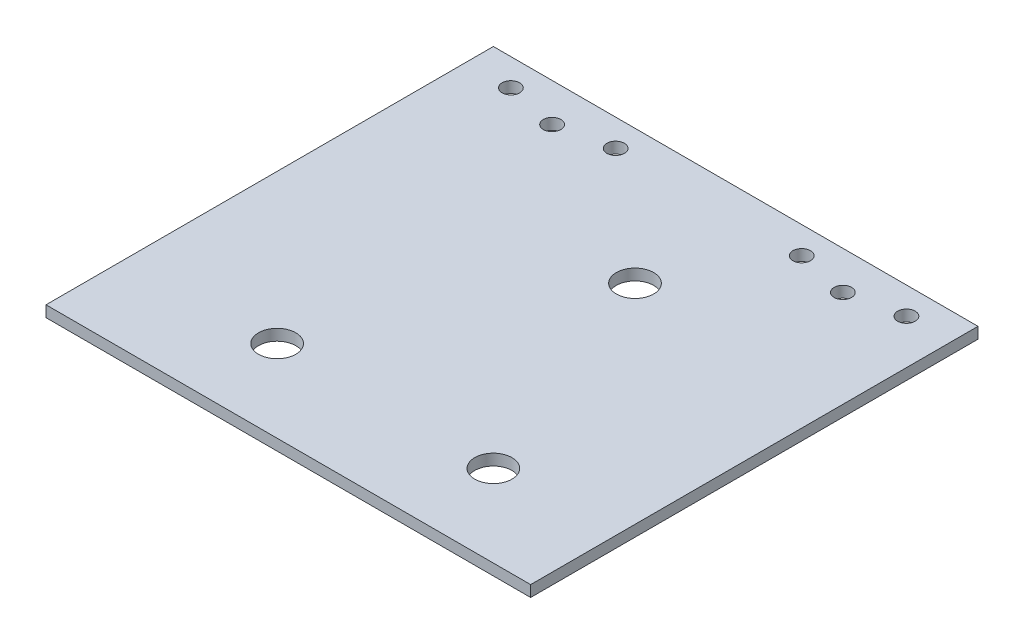
ISO-10303-21;
HEADER;
FILE_DESCRIPTION(('STEP AP214'),'2;1');
FILE_NAME('part.step','',(''),(''),'','','');
FILE_SCHEMA(('AUTOMOTIVE_DESIGN { 1 0 10303 214 1 1 1 1 }'));
ENDSEC;
DATA;
#1=APPLICATION_CONTEXT('core data for automotive mechanical design processes');
#2=APPLICATION_PROTOCOL_DEFINITION('international standard','automotive_design',2000,#1);
#3=PRODUCT_CONTEXT('',#1,'mechanical');
#4=PRODUCT('Part','Part','',(#3));
#5=PRODUCT_RELATED_PRODUCT_CATEGORY('part','',(#4));
#6=PRODUCT_DEFINITION_FORMATION('','',#4);
#7=PRODUCT_DEFINITION_CONTEXT('part definition',#1,'design');
#8=PRODUCT_DEFINITION('design','',#6,#7);
#9=PRODUCT_DEFINITION_SHAPE('','',#8);
#10=(LENGTH_UNIT() NAMED_UNIT(*) SI_UNIT(.MILLI.,.METRE.));
#11=(NAMED_UNIT(*) PLANE_ANGLE_UNIT() SI_UNIT($,.RADIAN.));
#12=(NAMED_UNIT(*) SI_UNIT($,.STERADIAN.) SOLID_ANGLE_UNIT());
#13=UNCERTAINTY_MEASURE_WITH_UNIT(LENGTH_MEASURE(1.E-05),#10,'distance_accuracy_value','');
#14=(GEOMETRIC_REPRESENTATION_CONTEXT(3) GLOBAL_UNCERTAINTY_ASSIGNED_CONTEXT((#13)) GLOBAL_UNIT_ASSIGNED_CONTEXT((#10,
#11,#12)) REPRESENTATION_CONTEXT('',''));
#15=CARTESIAN_POINT('',(0.,0.,0.));
#16=DIRECTION('',(0.,0.,1.));
#17=DIRECTION('',(1.,0.,0.));
#18=AXIS2_PLACEMENT_3D('',#15,#16,#17);
#19=CARTESIAN_POINT('',(0.,3.,0.));
#20=DIRECTION('',(1.,0.,0.));
#21=DIRECTION('',(0.,0.,-1.));
#22=AXIS2_PLACEMENT_3D('',#19,#20,#21);
#23=PLANE('',#22);
#24=DIRECTION('',(0.,-1.,0.));
#25=VECTOR('',#24,1.);
#26=CARTESIAN_POINT('',(0.,3.,30.));
#27=LINE('',#26,#25);
#28=CARTESIAN_POINT('',(0.,3.,30.));
#29=VERTEX_POINT('',#28);
#30=CARTESIAN_POINT('',(0.,0.,30.));
#31=VERTEX_POINT('',#30);
#32=EDGE_CURVE('E110',#29,#31,#27,.T.);
#33=ORIENTED_EDGE('',*,*,#32,.T.);
#34=DIRECTION('',(0.,0.,1.));
#35=VECTOR('',#34,1.);
#36=CARTESIAN_POINT('',(0.,0.,0.));
#37=LINE('',#36,#35);
#38=CARTESIAN_POINT('',(0.,0.,150.));
#39=VERTEX_POINT('',#38);
#40=EDGE_CURVE('E77',#31,#39,#37,.T.);
#41=ORIENTED_EDGE('',*,*,#40,.T.);
#42=DIRECTION('',(0.,-1.,0.));
#43=VECTOR('',#42,1.);
#44=CARTESIAN_POINT('',(0.,3.,150.));
#45=LINE('',#44,#43);
#46=CARTESIAN_POINT('',(0.,3.,150.));
#47=VERTEX_POINT('',#46);
#48=EDGE_CURVE('E11',#47,#39,#45,.T.);
#49=ORIENTED_EDGE('',*,*,#48,.F.);
#50=DIRECTION('',(0.,0.,1.));
#51=VECTOR('',#50,1.);
#52=CARTESIAN_POINT('',(0.,3.,0.));
#53=LINE('',#52,#51);
#54=EDGE_CURVE('E85',#29,#47,#53,.T.);
#55=ORIENTED_EDGE('',*,*,#54,.F.);
#56=EDGE_LOOP('',(#33,#41,#49,#55));
#57=FACE_BOUND('',#56,.T.);
#58=ADVANCED_FACE('F33',(#57),#23,.F.);
#59=CARTESIAN_POINT('',(130.,3.,0.));
#60=DIRECTION('',(-1.,0.,0.));
#61=DIRECTION('',(0.,0.,1.));
#62=AXIS2_PLACEMENT_3D('',#59,#60,#61);
#63=PLANE('',#62);
#64=DIRECTION('',(0.,-1.,0.));
#65=VECTOR('',#64,1.);
#66=CARTESIAN_POINT('',(130.,3.,30.));
#67=LINE('',#66,#65);
#68=CARTESIAN_POINT('',(130.,3.,30.));
#69=VERTEX_POINT('',#68);
#70=CARTESIAN_POINT('',(130.,0.,30.));
#71=VERTEX_POINT('',#70);
#72=EDGE_CURVE('E47',#69,#71,#67,.T.);
#73=ORIENTED_EDGE('',*,*,#72,.F.);
#74=DIRECTION('',(0.,0.,-1.));
#75=VECTOR('',#74,1.);
#76=CARTESIAN_POINT('',(130.,3.,0.));
#77=LINE('',#76,#75);
#78=CARTESIAN_POINT('',(130.,3.,150.));
#79=VERTEX_POINT('',#78);
#80=EDGE_CURVE('E82',#79,#69,#77,.T.);
#81=ORIENTED_EDGE('',*,*,#80,.F.);
#82=DIRECTION('',(0.,-1.,0.));
#83=VECTOR('',#82,1.);
#84=CARTESIAN_POINT('',(130.,3.,150.));
#85=LINE('',#84,#83);
#86=CARTESIAN_POINT('',(130.,0.,150.));
#87=VERTEX_POINT('',#86);
#88=EDGE_CURVE('E40',#79,#87,#85,.T.);
#89=ORIENTED_EDGE('',*,*,#88,.T.);
#90=DIRECTION('',(0.,0.,-1.));
#91=VECTOR('',#90,1.);
#92=CARTESIAN_POINT('',(130.,0.,0.));
#93=LINE('',#92,#91);
#94=EDGE_CURVE('E76',#87,#71,#93,.T.);
#95=ORIENTED_EDGE('',*,*,#94,.T.);
#96=EDGE_LOOP('',(#73,#81,#89,#95));
#97=FACE_BOUND('',#96,.T.);
#98=ADVANCED_FACE('F81',(#97),#63,.F.);
#99=CARTESIAN_POINT('',(0.,3.,0.));
#100=DIRECTION('',(0.,1.,0.));
#101=DIRECTION('',(0.,0.,1.));
#102=AXIS2_PLACEMENT_3D('',#99,#100,#101);
#103=PLANE('',#102);
#104=CARTESIAN_POINT('',(26.,3.,40.25));
#105=DIRECTION('',(0.,1.,0.));
#106=DIRECTION('',(0.,0.,1.));
#107=AXIS2_PLACEMENT_3D('',#104,#105,#106);
#108=CIRCLE('',#107,2.35);
#109=CARTESIAN_POINT('',(26.,3.,37.9));
#110=VERTEX_POINT('',#109);
#111=EDGE_CURVE('E145',#110,#110,#108,.T.);
#112=ORIENTED_EDGE('',*,*,#111,.F.);
#113=EDGE_LOOP('',(#112));
#114=FACE_BOUND('',#113,.T.);
#115=CARTESIAN_POINT('',(40.05,3.,37.25));
#116=DIRECTION('',(0.,1.,0.));
#117=DIRECTION('',(0.,0.,1.));
#118=AXIS2_PLACEMENT_3D('',#115,#116,#117);
#119=CIRCLE('',#118,2.35);
#120=CARTESIAN_POINT('',(40.05,3.,34.9));
#121=VERTEX_POINT('',#120);
#122=EDGE_CURVE('E139',#121,#121,#119,.T.);
#123=ORIENTED_EDGE('',*,*,#122,.F.);
#124=EDGE_LOOP('',(#123));
#125=FACE_BOUND('',#124,.T.);
#126=CARTESIAN_POINT('',(11.95,3.,37.25));
#127=DIRECTION('',(0.,1.,0.));
#128=DIRECTION('',(0.,0.,1.));
#129=AXIS2_PLACEMENT_3D('',#126,#127,#128);
#130=CIRCLE('',#129,2.35);
#131=CARTESIAN_POINT('',(11.95,3.,34.9));
#132=VERTEX_POINT('',#131);
#133=EDGE_CURVE('E133',#132,#132,#130,.T.);
#134=ORIENTED_EDGE('',*,*,#133,.F.);
#135=EDGE_LOOP('',(#134));
#136=FACE_BOUND('',#135,.T.);
#137=CARTESIAN_POINT('',(104.,3.,40.25));
#138=DIRECTION('',(0.,1.,0.));
#139=DIRECTION('',(0.,0.,1.));
#140=AXIS2_PLACEMENT_3D('',#137,#138,#139);
#141=CIRCLE('',#140,2.35);
#142=CARTESIAN_POINT('',(104.,3.,37.9));
#143=VERTEX_POINT('',#142);
#144=EDGE_CURVE('E127',#143,#143,#141,.T.);
#145=ORIENTED_EDGE('',*,*,#144,.F.);
#146=EDGE_LOOP('',(#145));
#147=FACE_BOUND('',#146,.T.);
#148=CARTESIAN_POINT('',(118.05,3.,37.25));
#149=DIRECTION('',(0.,1.,0.));
#150=DIRECTION('',(0.,0.,1.));
#151=AXIS2_PLACEMENT_3D('',#148,#149,#150);
#152=CIRCLE('',#151,2.35);
#153=CARTESIAN_POINT('',(118.05,3.,34.9));
#154=VERTEX_POINT('',#153);
#155=EDGE_CURVE('E121',#154,#154,#152,.T.);
#156=ORIENTED_EDGE('',*,*,#155,.F.);
#157=EDGE_LOOP('',(#156));
#158=FACE_BOUND('',#157,.T.);
#159=CARTESIAN_POINT('',(89.95,3.,37.25));
#160=DIRECTION('',(0.,1.,0.));
#161=DIRECTION('',(0.,0.,1.));
#162=AXIS2_PLACEMENT_3D('',#159,#160,#161);
#163=CIRCLE('',#162,2.35);
#164=CARTESIAN_POINT('',(89.95,3.,34.9));
#165=VERTEX_POINT('',#164);
#166=EDGE_CURVE('E116',#165,#165,#163,.T.);
#167=ORIENTED_EDGE('',*,*,#166,.F.);
#168=EDGE_LOOP('',(#167));
#169=FACE_BOUND('',#168,.T.);
#170=CARTESIAN_POINT('',(74.,3.,66.));
#171=DIRECTION('',(0.,1.,0.));
#172=DIRECTION('',(0.,0.,1.));
#173=AXIS2_PLACEMENT_3D('',#170,#171,#172);
#174=CIRCLE('',#173,5.);
#175=CARTESIAN_POINT('',(74.,3.,71.));
#176=VERTEX_POINT('',#175);
#177=EDGE_CURVE('E95',#176,#176,#174,.T.);
#178=ORIENTED_EDGE('',*,*,#177,.F.);
#179=EDGE_LOOP('',(#178));
#180=FACE_BOUND('',#179,.T.);
#181=CARTESIAN_POINT('',(98.,3.,128.));
#182=DIRECTION('',(0.,1.,0.));
#183=DIRECTION('',(0.,0.,1.));
#184=AXIS2_PLACEMENT_3D('',#181,#182,#183);
#185=CIRCLE('',#184,5.);
#186=CARTESIAN_POINT('',(98.,3.,133.));
#187=VERTEX_POINT('',#186);
#188=EDGE_CURVE('E101',#187,#187,#185,.T.);
#189=ORIENTED_EDGE('',*,*,#188,.F.);
#190=EDGE_LOOP('',(#189));
#191=FACE_BOUND('',#190,.T.);
#192=CARTESIAN_POINT('',(40.,3.,128.));
#193=DIRECTION('',(0.,1.,0.));
#194=DIRECTION('',(0.,0.,1.));
#195=AXIS2_PLACEMENT_3D('',#192,#193,#194);
#196=CIRCLE('',#195,5.);
#197=CARTESIAN_POINT('',(40.,3.,133.));
#198=VERTEX_POINT('',#197);
#199=EDGE_CURVE('E107',#198,#198,#196,.T.);
#200=ORIENTED_EDGE('',*,*,#199,.F.);
#201=EDGE_LOOP('',(#200));
#202=FACE_BOUND('',#201,.T.);
#203=ORIENTED_EDGE('',*,*,#80,.T.);
#204=DIRECTION('',(1.,0.,0.));
#205=VECTOR('',#204,1.);
#206=CARTESIAN_POINT('',(0.,3.,30.));
#207=LINE('',#206,#205);
#208=EDGE_CURVE('E114',#29,#69,#207,.T.);
#209=ORIENTED_EDGE('',*,*,#208,.F.);
#210=ORIENTED_EDGE('',*,*,#54,.T.);
#211=DIRECTION('',(1.,0.,0.));
#212=VECTOR('',#211,1.);
#213=CARTESIAN_POINT('',(0.,3.,150.));
#214=LINE('',#213,#212);
#215=EDGE_CURVE('E56',#47,#79,#214,.T.);
#216=ORIENTED_EDGE('',*,*,#215,.T.);
#217=EDGE_LOOP('',(#203,#209,#210,#216));
#218=FACE_BOUND('',#217,.T.);
#219=ADVANCED_FACE('F157',(#114,#125,#136,#147,#158,#169,#180,#191,#202,#218),#103,.T.);
#220=CARTESIAN_POINT('',(0.,0.,0.));
#221=DIRECTION('',(0.,1.,0.));
#222=DIRECTION('',(0.,0.,1.));
#223=AXIS2_PLACEMENT_3D('',#220,#221,#222);
#224=PLANE('',#223);
#225=CARTESIAN_POINT('',(26.,0.,40.25));
#226=DIRECTION('',(0.,1.,0.));
#227=DIRECTION('',(0.,0.,1.));
#228=AXIS2_PLACEMENT_3D('',#225,#226,#227);
#229=CIRCLE('',#228,2.35);
#230=CARTESIAN_POINT('',(26.,0.,37.9));
#231=VERTEX_POINT('',#230);
#232=EDGE_CURVE('E148',#231,#231,#229,.T.);
#233=ORIENTED_EDGE('',*,*,#232,.T.);
#234=EDGE_LOOP('',(#233));
#235=FACE_BOUND('',#234,.T.);
#236=CARTESIAN_POINT('',(40.05,0.,37.25));
#237=DIRECTION('',(0.,1.,0.));
#238=DIRECTION('',(0.,0.,1.));
#239=AXIS2_PLACEMENT_3D('',#236,#237,#238);
#240=CIRCLE('',#239,2.35);
#241=CARTESIAN_POINT('',(40.05,0.,34.9));
#242=VERTEX_POINT('',#241);
#243=EDGE_CURVE('E142',#242,#242,#240,.T.);
#244=ORIENTED_EDGE('',*,*,#243,.T.);
#245=EDGE_LOOP('',(#244));
#246=FACE_BOUND('',#245,.T.);
#247=CARTESIAN_POINT('',(11.95,0.,37.25));
#248=DIRECTION('',(0.,1.,0.));
#249=DIRECTION('',(0.,0.,1.));
#250=AXIS2_PLACEMENT_3D('',#247,#248,#249);
#251=CIRCLE('',#250,2.35);
#252=CARTESIAN_POINT('',(11.95,0.,34.9));
#253=VERTEX_POINT('',#252);
#254=EDGE_CURVE('E136',#253,#253,#251,.T.);
#255=ORIENTED_EDGE('',*,*,#254,.T.);
#256=EDGE_LOOP('',(#255));
#257=FACE_BOUND('',#256,.T.);
#258=CARTESIAN_POINT('',(104.,0.,40.25));
#259=DIRECTION('',(0.,1.,0.));
#260=DIRECTION('',(0.,0.,1.));
#261=AXIS2_PLACEMENT_3D('',#258,#259,#260);
#262=CIRCLE('',#261,2.35);
#263=CARTESIAN_POINT('',(104.,0.,37.9));
#264=VERTEX_POINT('',#263);
#265=EDGE_CURVE('E130',#264,#264,#262,.T.);
#266=ORIENTED_EDGE('',*,*,#265,.T.);
#267=EDGE_LOOP('',(#266));
#268=FACE_BOUND('',#267,.T.);
#269=CARTESIAN_POINT('',(118.05,0.,37.25));
#270=DIRECTION('',(0.,1.,0.));
#271=DIRECTION('',(0.,0.,1.));
#272=AXIS2_PLACEMENT_3D('',#269,#270,#271);
#273=CIRCLE('',#272,2.35);
#274=CARTESIAN_POINT('',(118.05,0.,34.9));
#275=VERTEX_POINT('',#274);
#276=EDGE_CURVE('E124',#275,#275,#273,.T.);
#277=ORIENTED_EDGE('',*,*,#276,.T.);
#278=EDGE_LOOP('',(#277));
#279=FACE_BOUND('',#278,.T.);
#280=CARTESIAN_POINT('',(89.95,0.,37.25));
#281=DIRECTION('',(0.,1.,0.));
#282=DIRECTION('',(0.,0.,1.));
#283=AXIS2_PLACEMENT_3D('',#280,#281,#282);
#284=CIRCLE('',#283,2.35);
#285=CARTESIAN_POINT('',(89.95,0.,34.9));
#286=VERTEX_POINT('',#285);
#287=EDGE_CURVE('E118',#286,#286,#284,.T.);
#288=ORIENTED_EDGE('',*,*,#287,.T.);
#289=EDGE_LOOP('',(#288));
#290=FACE_BOUND('',#289,.T.);
#291=CARTESIAN_POINT('',(74.,0.,66.));
#292=DIRECTION('',(0.,1.,0.));
#293=DIRECTION('',(0.,0.,1.));
#294=AXIS2_PLACEMENT_3D('',#291,#292,#293);
#295=CIRCLE('',#294,5.);
#296=CARTESIAN_POINT('',(74.,0.,71.));
#297=VERTEX_POINT('',#296);
#298=EDGE_CURVE('E90',#297,#297,#295,.T.);
#299=ORIENTED_EDGE('',*,*,#298,.T.);
#300=EDGE_LOOP('',(#299));
#301=FACE_BOUND('',#300,.T.);
#302=CARTESIAN_POINT('',(98.,0.,128.));
#303=DIRECTION('',(0.,1.,0.));
#304=DIRECTION('',(0.,0.,1.));
#305=AXIS2_PLACEMENT_3D('',#302,#303,#304);
#306=CIRCLE('',#305,5.);
#307=CARTESIAN_POINT('',(98.,0.,133.));
#308=VERTEX_POINT('',#307);
#309=EDGE_CURVE('E98',#308,#308,#306,.T.);
#310=ORIENTED_EDGE('',*,*,#309,.T.);
#311=EDGE_LOOP('',(#310));
#312=FACE_BOUND('',#311,.T.);
#313=CARTESIAN_POINT('',(40.,0.,128.));
#314=DIRECTION('',(0.,1.,0.));
#315=DIRECTION('',(0.,0.,1.));
#316=AXIS2_PLACEMENT_3D('',#313,#314,#315);
#317=CIRCLE('',#316,5.);
#318=CARTESIAN_POINT('',(40.,0.,133.));
#319=VERTEX_POINT('',#318);
#320=EDGE_CURVE('E104',#319,#319,#317,.T.);
#321=ORIENTED_EDGE('',*,*,#320,.T.);
#322=EDGE_LOOP('',(#321));
#323=FACE_BOUND('',#322,.T.);
#324=DIRECTION('',(1.,0.,0.));
#325=VECTOR('',#324,1.);
#326=CARTESIAN_POINT('',(0.,0.,30.));
#327=LINE('',#326,#325);
#328=EDGE_CURVE('E84',#31,#71,#327,.T.);
#329=ORIENTED_EDGE('',*,*,#328,.T.);
#330=ORIENTED_EDGE('',*,*,#94,.F.);
#331=DIRECTION('',(1.,0.,0.));
#332=VECTOR('',#331,1.);
#333=CARTESIAN_POINT('',(0.,0.,150.));
#334=LINE('',#333,#332);
#335=EDGE_CURVE('E68',#39,#87,#334,.T.);
#336=ORIENTED_EDGE('',*,*,#335,.F.);
#337=ORIENTED_EDGE('',*,*,#40,.F.);
#338=EDGE_LOOP('',(#329,#330,#336,#337));
#339=FACE_BOUND('',#338,.T.);
#340=ADVANCED_FACE('F83',(#235,#246,#257,#268,#279,#290,#301,#312,#323,#339),#224,.F.);
#341=CARTESIAN_POINT('',(0.,3.,150.));
#342=DIRECTION('',(0.,0.,-1.));
#343=DIRECTION('',(-1.,0.,0.));
#344=AXIS2_PLACEMENT_3D('',#341,#342,#343);
#345=PLANE('',#344);
#346=ORIENTED_EDGE('',*,*,#335,.T.);
#347=ORIENTED_EDGE('',*,*,#88,.F.);
#348=ORIENTED_EDGE('',*,*,#215,.F.);
#349=ORIENTED_EDGE('',*,*,#48,.T.);
#350=EDGE_LOOP('',(#346,#347,#348,#349));
#351=FACE_BOUND('',#350,.T.);
#352=ADVANCED_FACE('F70',(#351),#345,.F.);
#353=CARTESIAN_POINT('',(74.,3.,66.));
#354=DIRECTION('',(0.,1.,0.));
#355=DIRECTION('',(0.,0.,1.));
#356=AXIS2_PLACEMENT_3D('',#353,#354,#355);
#357=CYLINDRICAL_SURFACE('',#356,5.);
#358=ORIENTED_EDGE('',*,*,#298,.F.);
#359=EDGE_LOOP('',(#358));
#360=FACE_BOUND('',#359,.T.);
#361=ORIENTED_EDGE('',*,*,#177,.T.);
#362=EDGE_LOOP('',(#361));
#363=FACE_BOUND('',#362,.T.);
#364=ADVANCED_FACE('F194',(#360,#363),#357,.F.);
#365=CARTESIAN_POINT('',(98.,3.,128.));
#366=DIRECTION('',(0.,1.,0.));
#367=DIRECTION('',(0.,0.,1.));
#368=AXIS2_PLACEMENT_3D('',#365,#366,#367);
#369=CYLINDRICAL_SURFACE('',#368,5.);
#370=ORIENTED_EDGE('',*,*,#309,.F.);
#371=EDGE_LOOP('',(#370));
#372=FACE_BOUND('',#371,.T.);
#373=ORIENTED_EDGE('',*,*,#188,.T.);
#374=EDGE_LOOP('',(#373));
#375=FACE_BOUND('',#374,.T.);
#376=ADVANCED_FACE('F199',(#372,#375),#369,.F.);
#377=CARTESIAN_POINT('',(40.,3.,128.));
#378=DIRECTION('',(0.,1.,0.));
#379=DIRECTION('',(0.,0.,1.));
#380=AXIS2_PLACEMENT_3D('',#377,#378,#379);
#381=CYLINDRICAL_SURFACE('',#380,5.);
#382=ORIENTED_EDGE('',*,*,#320,.F.);
#383=EDGE_LOOP('',(#382));
#384=FACE_BOUND('',#383,.T.);
#385=ORIENTED_EDGE('',*,*,#199,.T.);
#386=EDGE_LOOP('',(#385));
#387=FACE_BOUND('',#386,.T.);
#388=ADVANCED_FACE('F223',(#384,#387),#381,.F.);
#389=CARTESIAN_POINT('',(0.,3.,30.));
#390=DIRECTION('',(0.,0.,-1.));
#391=DIRECTION('',(-1.,0.,0.));
#392=AXIS2_PLACEMENT_3D('',#389,#390,#391);
#393=PLANE('',#392);
#394=ORIENTED_EDGE('',*,*,#328,.F.);
#395=ORIENTED_EDGE('',*,*,#32,.F.);
#396=ORIENTED_EDGE('',*,*,#208,.T.);
#397=ORIENTED_EDGE('',*,*,#72,.T.);
#398=EDGE_LOOP('',(#394,#395,#396,#397));
#399=FACE_BOUND('',#398,.T.);
#400=ADVANCED_FACE('F183',(#399),#393,.T.);
#401=CARTESIAN_POINT('',(89.95,3.,37.25));
#402=DIRECTION('',(0.,-1.,0.));
#403=DIRECTION('',(0.,0.,-1.));
#404=AXIS2_PLACEMENT_3D('',#401,#402,#403);
#405=CYLINDRICAL_SURFACE('',#404,2.35);
#406=CARTESIAN_POINT('',(89.95,3.,34.9));
#407=CARTESIAN_POINT('',(89.95,2.96875,34.9));
#408=CARTESIAN_POINT('',(89.95,2.9375,34.9));
#409=CARTESIAN_POINT('',(89.95,2.875,34.9));
#410=CARTESIAN_POINT('',(89.95,2.84375,34.9));
#411=CARTESIAN_POINT('',(89.95,2.78125,34.9));
#412=CARTESIAN_POINT('',(89.95,2.75,34.9));
#413=CARTESIAN_POINT('',(89.95,2.6875,34.9));
#414=CARTESIAN_POINT('',(89.95,2.65625,34.9));
#415=CARTESIAN_POINT('',(89.95,2.59375,34.9));
#416=CARTESIAN_POINT('',(89.95,2.5625,34.9));
#417=CARTESIAN_POINT('',(89.95,2.5,34.9));
#418=CARTESIAN_POINT('',(89.95,2.46875,34.9));
#419=CARTESIAN_POINT('',(89.95,2.40625,34.9));
#420=CARTESIAN_POINT('',(89.95,2.375,34.9));
#421=CARTESIAN_POINT('',(89.95,2.3125,34.9));
#422=CARTESIAN_POINT('',(89.95,2.28125,34.9));
#423=CARTESIAN_POINT('',(89.95,2.21875,34.9));
#424=CARTESIAN_POINT('',(89.95,2.1875,34.9));
#425=CARTESIAN_POINT('',(89.95,2.125,34.9));
#426=CARTESIAN_POINT('',(89.95,2.09375,34.9));
#427=CARTESIAN_POINT('',(89.95,2.03125,34.9));
#428=CARTESIAN_POINT('',(89.95,2.,34.9));
#429=CARTESIAN_POINT('',(89.95,1.9375,34.9));
#430=CARTESIAN_POINT('',(89.95,1.90625,34.9));
#431=CARTESIAN_POINT('',(89.95,1.84375,34.9));
#432=CARTESIAN_POINT('',(89.95,1.8125,34.9));
#433=CARTESIAN_POINT('',(89.95,1.75,34.9));
#434=CARTESIAN_POINT('',(89.95,1.71875,34.9));
#435=CARTESIAN_POINT('',(89.95,1.65625,34.9));
#436=CARTESIAN_POINT('',(89.95,1.625,34.9));
#437=CARTESIAN_POINT('',(89.95,1.5625,34.9));
#438=CARTESIAN_POINT('',(89.95,1.53125,34.9));
#439=CARTESIAN_POINT('',(89.95,1.46875,34.9));
#440=CARTESIAN_POINT('',(89.95,1.4375,34.9));
#441=CARTESIAN_POINT('',(89.95,1.375,34.9));
#442=CARTESIAN_POINT('',(89.95,1.34375,34.9));
#443=CARTESIAN_POINT('',(89.95,1.28125,34.9));
#444=CARTESIAN_POINT('',(89.95,1.25,34.9));
#445=CARTESIAN_POINT('',(89.95,1.1875,34.9));
#446=CARTESIAN_POINT('',(89.95,1.15625,34.9));
#447=CARTESIAN_POINT('',(89.95,1.09375,34.9));
#448=CARTESIAN_POINT('',(89.95,1.0625,34.9));
#449=CARTESIAN_POINT('',(89.95,1.,34.9));
#450=CARTESIAN_POINT('',(89.95,0.96875,34.9));
#451=CARTESIAN_POINT('',(89.95,0.90625,34.9));
#452=CARTESIAN_POINT('',(89.95,0.875,34.9));
#453=CARTESIAN_POINT('',(89.95,0.8125,34.9));
#454=CARTESIAN_POINT('',(89.95,0.78125,34.9));
#455=CARTESIAN_POINT('',(89.95,0.71875,34.9));
#456=CARTESIAN_POINT('',(89.95,0.6875,34.9));
#457=CARTESIAN_POINT('',(89.95,0.625,34.9));
#458=CARTESIAN_POINT('',(89.95,0.59375,34.9));
#459=CARTESIAN_POINT('',(89.95,0.53125,34.9));
#460=CARTESIAN_POINT('',(89.95,0.5,34.9));
#461=CARTESIAN_POINT('',(89.95,0.4375,34.9));
#462=CARTESIAN_POINT('',(89.95,0.40625,34.9));
#463=CARTESIAN_POINT('',(89.95,0.34375,34.9));
#464=CARTESIAN_POINT('',(89.95,0.3125,34.9));
#465=CARTESIAN_POINT('',(89.95,0.25,34.9));
#466=CARTESIAN_POINT('',(89.95,0.21875,34.9));
#467=CARTESIAN_POINT('',(89.95,0.15625,34.9));
#468=CARTESIAN_POINT('',(89.95,0.125,34.9));
#469=CARTESIAN_POINT('',(89.95,0.0625000000000001,34.9));
#470=CARTESIAN_POINT('',(89.95,0.03125,34.9));
#471=CARTESIAN_POINT('',(89.95,0.,34.9));
#472=B_SPLINE_CURVE_WITH_KNOTS('',3,(#406,#407,#408,#409,#410,#411,#412,#413,#414,#415,#416,
#417,#418,#419,#420,#421,#422,#423,#424,#425,#426,#427,#428,#429,#430,#431,#432,#433,#434,#435,
#436,#437,#438,#439,#440,#441,#442,#443,#444,#445,#446,#447,#448,#449,#450,#451,#452,#453,#454,
#455,#456,#457,#458,#459,#460,#461,#462,#463,#464,#465,#466,#467,#468,#469,#470,#471),
.UNSPECIFIED.,.F.,.F.,(4,2,2,2,2,2,2,2,2,2,2,2,2,2,2,2,2,2,2,2,2,2,2,2,2,2,2,2,2,2,2,2,4),(0.,
0.0937499999999997,0.1875,0.28125,0.375,0.46875,0.5625,0.65625,0.75,0.84375,0.9375,1.03125,
1.125,1.21875,1.3125,1.40625,1.5,1.59375,1.6875,1.78125,1.875,1.96875,2.0625,2.15625,2.25,
2.34375,2.4375,2.53125,2.625,2.71875,2.8125,2.90625,3.),.UNSPECIFIED.);
#473=EDGE_CURVE('BSEAM231',#165,#286,#472,.T.);
#474=ORIENTED_EDGE('',*,*,#166,.T.);
#475=ORIENTED_EDGE('',*,*,#287,.F.);
#476=ORIENTED_EDGE('',*,*,#473,.T.);
#477=ORIENTED_EDGE('',*,*,#473,.F.);
#478=EDGE_LOOP('',(#474,#476,#475,#477));
#479=FACE_BOUND('',#478,.T.);
#480=ADVANCED_FACE('F231',(#479),#405,.F.);
#481=CARTESIAN_POINT('',(118.05,3.,37.25));
#482=DIRECTION('',(0.,-1.,0.));
#483=DIRECTION('',(0.,0.,-1.));
#484=AXIS2_PLACEMENT_3D('',#481,#482,#483);
#485=CYLINDRICAL_SURFACE('',#484,2.35);
#486=CARTESIAN_POINT('',(118.05,3.,34.9));
#487=CARTESIAN_POINT('',(118.05,2.96875,34.9));
#488=CARTESIAN_POINT('',(118.05,2.9375,34.9));
#489=CARTESIAN_POINT('',(118.05,2.875,34.9));
#490=CARTESIAN_POINT('',(118.05,2.84375,34.9));
#491=CARTESIAN_POINT('',(118.05,2.78125,34.9));
#492=CARTESIAN_POINT('',(118.05,2.75,34.9));
#493=CARTESIAN_POINT('',(118.05,2.6875,34.9));
#494=CARTESIAN_POINT('',(118.05,2.65625,34.9));
#495=CARTESIAN_POINT('',(118.05,2.59375,34.9));
#496=CARTESIAN_POINT('',(118.05,2.5625,34.9));
#497=CARTESIAN_POINT('',(118.05,2.5,34.9));
#498=CARTESIAN_POINT('',(118.05,2.46875,34.9));
#499=CARTESIAN_POINT('',(118.05,2.40625,34.9));
#500=CARTESIAN_POINT('',(118.05,2.375,34.9));
#501=CARTESIAN_POINT('',(118.05,2.3125,34.9));
#502=CARTESIAN_POINT('',(118.05,2.28125,34.9));
#503=CARTESIAN_POINT('',(118.05,2.21875,34.9));
#504=CARTESIAN_POINT('',(118.05,2.1875,34.9));
#505=CARTESIAN_POINT('',(118.05,2.125,34.9));
#506=CARTESIAN_POINT('',(118.05,2.09375,34.9));
#507=CARTESIAN_POINT('',(118.05,2.03125,34.9));
#508=CARTESIAN_POINT('',(118.05,2.,34.9));
#509=CARTESIAN_POINT('',(118.05,1.9375,34.9));
#510=CARTESIAN_POINT('',(118.05,1.90625,34.9));
#511=CARTESIAN_POINT('',(118.05,1.84375,34.9));
#512=CARTESIAN_POINT('',(118.05,1.8125,34.9));
#513=CARTESIAN_POINT('',(118.05,1.75,34.9));
#514=CARTESIAN_POINT('',(118.05,1.71875,34.9));
#515=CARTESIAN_POINT('',(118.05,1.65625,34.9));
#516=CARTESIAN_POINT('',(118.05,1.625,34.9));
#517=CARTESIAN_POINT('',(118.05,1.5625,34.9));
#518=CARTESIAN_POINT('',(118.05,1.53125,34.9));
#519=CARTESIAN_POINT('',(118.05,1.46875,34.9));
#520=CARTESIAN_POINT('',(118.05,1.4375,34.9));
#521=CARTESIAN_POINT('',(118.05,1.375,34.9));
#522=CARTESIAN_POINT('',(118.05,1.34375,34.9));
#523=CARTESIAN_POINT('',(118.05,1.28125,34.9));
#524=CARTESIAN_POINT('',(118.05,1.25,34.9));
#525=CARTESIAN_POINT('',(118.05,1.1875,34.9));
#526=CARTESIAN_POINT('',(118.05,1.15625,34.9));
#527=CARTESIAN_POINT('',(118.05,1.09375,34.9));
#528=CARTESIAN_POINT('',(118.05,1.0625,34.9));
#529=CARTESIAN_POINT('',(118.05,1.,34.9));
#530=CARTESIAN_POINT('',(118.05,0.96875,34.9));
#531=CARTESIAN_POINT('',(118.05,0.90625,34.9));
#532=CARTESIAN_POINT('',(118.05,0.875,34.9));
#533=CARTESIAN_POINT('',(118.05,0.8125,34.9));
#534=CARTESIAN_POINT('',(118.05,0.78125,34.9));
#535=CARTESIAN_POINT('',(118.05,0.71875,34.9));
#536=CARTESIAN_POINT('',(118.05,0.6875,34.9));
#537=CARTESIAN_POINT('',(118.05,0.625,34.9));
#538=CARTESIAN_POINT('',(118.05,0.59375,34.9));
#539=CARTESIAN_POINT('',(118.05,0.53125,34.9));
#540=CARTESIAN_POINT('',(118.05,0.5,34.9));
#541=CARTESIAN_POINT('',(118.05,0.4375,34.9));
#542=CARTESIAN_POINT('',(118.05,0.40625,34.9));
#543=CARTESIAN_POINT('',(118.05,0.34375,34.9));
#544=CARTESIAN_POINT('',(118.05,0.3125,34.9));
#545=CARTESIAN_POINT('',(118.05,0.25,34.9));
#546=CARTESIAN_POINT('',(118.05,0.21875,34.9));
#547=CARTESIAN_POINT('',(118.05,0.15625,34.9));
#548=CARTESIAN_POINT('',(118.05,0.125,34.9));
#549=CARTESIAN_POINT('',(118.05,0.0625000000000001,34.9));
#550=CARTESIAN_POINT('',(118.05,0.03125,34.9));
#551=CARTESIAN_POINT('',(118.05,0.,34.9));
#552=B_SPLINE_CURVE_WITH_KNOTS('',3,(#486,#487,#488,#489,#490,#491,#492,#493,#494,#495,#496,
#497,#498,#499,#500,#501,#502,#503,#504,#505,#506,#507,#508,#509,#510,#511,#512,#513,#514,#515,
#516,#517,#518,#519,#520,#521,#522,#523,#524,#525,#526,#527,#528,#529,#530,#531,#532,#533,#534,
#535,#536,#537,#538,#539,#540,#541,#542,#543,#544,#545,#546,#547,#548,#549,#550,#551),
.UNSPECIFIED.,.F.,.F.,(4,2,2,2,2,2,2,2,2,2,2,2,2,2,2,2,2,2,2,2,2,2,2,2,2,2,2,2,2,2,2,2,4),(0.,
0.0937499999999997,0.1875,0.28125,0.375,0.46875,0.5625,0.65625,0.75,0.84375,0.9375,1.03125,
1.125,1.21875,1.3125,1.40625,1.5,1.59375,1.6875,1.78125,1.875,1.96875,2.0625,2.15625,2.25,
2.34375,2.4375,2.53125,2.625,2.71875,2.8125,2.90625,3.),.UNSPECIFIED.);
#553=EDGE_CURVE('BSEAM238',#154,#275,#552,.T.);
#554=ORIENTED_EDGE('',*,*,#155,.T.);
#555=ORIENTED_EDGE('',*,*,#276,.F.);
#556=ORIENTED_EDGE('',*,*,#553,.T.);
#557=ORIENTED_EDGE('',*,*,#553,.F.);
#558=EDGE_LOOP('',(#554,#556,#555,#557));
#559=FACE_BOUND('',#558,.T.);
#560=ADVANCED_FACE('F238',(#559),#485,.F.);
#561=CARTESIAN_POINT('',(104.,3.,40.25));
#562=DIRECTION('',(0.,-1.,0.));
#563=DIRECTION('',(0.,0.,-1.));
#564=AXIS2_PLACEMENT_3D('',#561,#562,#563);
#565=CYLINDRICAL_SURFACE('',#564,2.35);
#566=CARTESIAN_POINT('',(104.,3.,37.9));
#567=CARTESIAN_POINT('',(104.,2.96875,37.9));
#568=CARTESIAN_POINT('',(104.,2.9375,37.9));
#569=CARTESIAN_POINT('',(104.,2.875,37.9));
#570=CARTESIAN_POINT('',(104.,2.84375,37.9));
#571=CARTESIAN_POINT('',(104.,2.78125,37.9));
#572=CARTESIAN_POINT('',(104.,2.75,37.9));
#573=CARTESIAN_POINT('',(104.,2.6875,37.9));
#574=CARTESIAN_POINT('',(104.,2.65625,37.9));
#575=CARTESIAN_POINT('',(104.,2.59375,37.9));
#576=CARTESIAN_POINT('',(104.,2.5625,37.9));
#577=CARTESIAN_POINT('',(104.,2.5,37.9));
#578=CARTESIAN_POINT('',(104.,2.46875,37.9));
#579=CARTESIAN_POINT('',(104.,2.40625,37.9));
#580=CARTESIAN_POINT('',(104.,2.375,37.9));
#581=CARTESIAN_POINT('',(104.,2.3125,37.9));
#582=CARTESIAN_POINT('',(104.,2.28125,37.9));
#583=CARTESIAN_POINT('',(104.,2.21875,37.9));
#584=CARTESIAN_POINT('',(104.,2.1875,37.9));
#585=CARTESIAN_POINT('',(104.,2.125,37.9));
#586=CARTESIAN_POINT('',(104.,2.09375,37.9));
#587=CARTESIAN_POINT('',(104.,2.03125,37.9));
#588=CARTESIAN_POINT('',(104.,2.,37.9));
#589=CARTESIAN_POINT('',(104.,1.9375,37.9));
#590=CARTESIAN_POINT('',(104.,1.90625,37.9));
#591=CARTESIAN_POINT('',(104.,1.84375,37.9));
#592=CARTESIAN_POINT('',(104.,1.8125,37.9));
#593=CARTESIAN_POINT('',(104.,1.75,37.9));
#594=CARTESIAN_POINT('',(104.,1.71875,37.9));
#595=CARTESIAN_POINT('',(104.,1.65625,37.9));
#596=CARTESIAN_POINT('',(104.,1.625,37.9));
#597=CARTESIAN_POINT('',(104.,1.5625,37.9));
#598=CARTESIAN_POINT('',(104.,1.53125,37.9));
#599=CARTESIAN_POINT('',(104.,1.46875,37.9));
#600=CARTESIAN_POINT('',(104.,1.4375,37.9));
#601=CARTESIAN_POINT('',(104.,1.375,37.9));
#602=CARTESIAN_POINT('',(104.,1.34375,37.9));
#603=CARTESIAN_POINT('',(104.,1.28125,37.9));
#604=CARTESIAN_POINT('',(104.,1.25,37.9));
#605=CARTESIAN_POINT('',(104.,1.1875,37.9));
#606=CARTESIAN_POINT('',(104.,1.15625,37.9));
#607=CARTESIAN_POINT('',(104.,1.09375,37.9));
#608=CARTESIAN_POINT('',(104.,1.0625,37.9));
#609=CARTESIAN_POINT('',(104.,1.,37.9));
#610=CARTESIAN_POINT('',(104.,0.96875,37.9));
#611=CARTESIAN_POINT('',(104.,0.90625,37.9));
#612=CARTESIAN_POINT('',(104.,0.875,37.9));
#613=CARTESIAN_POINT('',(104.,0.8125,37.9));
#614=CARTESIAN_POINT('',(104.,0.78125,37.9));
#615=CARTESIAN_POINT('',(104.,0.71875,37.9));
#616=CARTESIAN_POINT('',(104.,0.6875,37.9));
#617=CARTESIAN_POINT('',(104.,0.625,37.9));
#618=CARTESIAN_POINT('',(104.,0.59375,37.9));
#619=CARTESIAN_POINT('',(104.,0.53125,37.9));
#620=CARTESIAN_POINT('',(104.,0.5,37.9));
#621=CARTESIAN_POINT('',(104.,0.4375,37.9));
#622=CARTESIAN_POINT('',(104.,0.40625,37.9));
#623=CARTESIAN_POINT('',(104.,0.34375,37.9));
#624=CARTESIAN_POINT('',(104.,0.3125,37.9));
#625=CARTESIAN_POINT('',(104.,0.25,37.9));
#626=CARTESIAN_POINT('',(104.,0.21875,37.9));
#627=CARTESIAN_POINT('',(104.,0.15625,37.9));
#628=CARTESIAN_POINT('',(104.,0.125,37.9));
#629=CARTESIAN_POINT('',(104.,0.0625000000000001,37.9));
#630=CARTESIAN_POINT('',(104.,0.03125,37.9));
#631=CARTESIAN_POINT('',(104.,0.,37.9));
#632=B_SPLINE_CURVE_WITH_KNOTS('',3,(#566,#567,#568,#569,#570,#571,#572,#573,#574,#575,#576,
#577,#578,#579,#580,#581,#582,#583,#584,#585,#586,#587,#588,#589,#590,#591,#592,#593,#594,#595,
#596,#597,#598,#599,#600,#601,#602,#603,#604,#605,#606,#607,#608,#609,#610,#611,#612,#613,#614,
#615,#616,#617,#618,#619,#620,#621,#622,#623,#624,#625,#626,#627,#628,#629,#630,#631),
.UNSPECIFIED.,.F.,.F.,(4,2,2,2,2,2,2,2,2,2,2,2,2,2,2,2,2,2,2,2,2,2,2,2,2,2,2,2,2,2,2,2,4),(0.,
0.0937499999999997,0.1875,0.28125,0.375,0.46875,0.5625,0.65625,0.75,0.84375,0.9375,1.03125,
1.125,1.21875,1.3125,1.40625,1.5,1.59375,1.6875,1.78125,1.875,1.96875,2.0625,2.15625,2.25,
2.34375,2.4375,2.53125,2.625,2.71875,2.8125,2.90625,3.),.UNSPECIFIED.);
#633=EDGE_CURVE('BSEAM242',#143,#264,#632,.T.);
#634=ORIENTED_EDGE('',*,*,#144,.T.);
#635=ORIENTED_EDGE('',*,*,#265,.F.);
#636=ORIENTED_EDGE('',*,*,#633,.T.);
#637=ORIENTED_EDGE('',*,*,#633,.F.);
#638=EDGE_LOOP('',(#634,#636,#635,#637));
#639=FACE_BOUND('',#638,.T.);
#640=ADVANCED_FACE('F242',(#639),#565,.F.);
#641=CARTESIAN_POINT('',(11.95,3.,37.25));
#642=DIRECTION('',(0.,-1.,0.));
#643=DIRECTION('',(0.,0.,-1.));
#644=AXIS2_PLACEMENT_3D('',#641,#642,#643);
#645=CYLINDRICAL_SURFACE('',#644,2.35);
#646=CARTESIAN_POINT('',(11.95,3.,34.9));
#647=CARTESIAN_POINT('',(11.95,2.96875,34.9));
#648=CARTESIAN_POINT('',(11.95,2.9375,34.9));
#649=CARTESIAN_POINT('',(11.95,2.875,34.9));
#650=CARTESIAN_POINT('',(11.95,2.84375,34.9));
#651=CARTESIAN_POINT('',(11.95,2.78125,34.9));
#652=CARTESIAN_POINT('',(11.95,2.75,34.9));
#653=CARTESIAN_POINT('',(11.95,2.6875,34.9));
#654=CARTESIAN_POINT('',(11.95,2.65625,34.9));
#655=CARTESIAN_POINT('',(11.95,2.59375,34.9));
#656=CARTESIAN_POINT('',(11.95,2.5625,34.9));
#657=CARTESIAN_POINT('',(11.95,2.5,34.9));
#658=CARTESIAN_POINT('',(11.95,2.46875,34.9));
#659=CARTESIAN_POINT('',(11.95,2.40625,34.9));
#660=CARTESIAN_POINT('',(11.95,2.375,34.9));
#661=CARTESIAN_POINT('',(11.95,2.3125,34.9));
#662=CARTESIAN_POINT('',(11.95,2.28125,34.9));
#663=CARTESIAN_POINT('',(11.95,2.21875,34.9));
#664=CARTESIAN_POINT('',(11.95,2.1875,34.9));
#665=CARTESIAN_POINT('',(11.95,2.125,34.9));
#666=CARTESIAN_POINT('',(11.95,2.09375,34.9));
#667=CARTESIAN_POINT('',(11.95,2.03125,34.9));
#668=CARTESIAN_POINT('',(11.95,2.,34.9));
#669=CARTESIAN_POINT('',(11.95,1.9375,34.9));
#670=CARTESIAN_POINT('',(11.95,1.90625,34.9));
#671=CARTESIAN_POINT('',(11.95,1.84375,34.9));
#672=CARTESIAN_POINT('',(11.95,1.8125,34.9));
#673=CARTESIAN_POINT('',(11.95,1.75,34.9));
#674=CARTESIAN_POINT('',(11.95,1.71875,34.9));
#675=CARTESIAN_POINT('',(11.95,1.65625,34.9));
#676=CARTESIAN_POINT('',(11.95,1.625,34.9));
#677=CARTESIAN_POINT('',(11.95,1.5625,34.9));
#678=CARTESIAN_POINT('',(11.95,1.53125,34.9));
#679=CARTESIAN_POINT('',(11.95,1.46875,34.9));
#680=CARTESIAN_POINT('',(11.95,1.4375,34.9));
#681=CARTESIAN_POINT('',(11.95,1.375,34.9));
#682=CARTESIAN_POINT('',(11.95,1.34375,34.9));
#683=CARTESIAN_POINT('',(11.95,1.28125,34.9));
#684=CARTESIAN_POINT('',(11.95,1.25,34.9));
#685=CARTESIAN_POINT('',(11.95,1.1875,34.9));
#686=CARTESIAN_POINT('',(11.95,1.15625,34.9));
#687=CARTESIAN_POINT('',(11.95,1.09375,34.9));
#688=CARTESIAN_POINT('',(11.95,1.0625,34.9));
#689=CARTESIAN_POINT('',(11.95,1.,34.9));
#690=CARTESIAN_POINT('',(11.95,0.96875,34.9));
#691=CARTESIAN_POINT('',(11.95,0.90625,34.9));
#692=CARTESIAN_POINT('',(11.95,0.875,34.9));
#693=CARTESIAN_POINT('',(11.95,0.8125,34.9));
#694=CARTESIAN_POINT('',(11.95,0.78125,34.9));
#695=CARTESIAN_POINT('',(11.95,0.71875,34.9));
#696=CARTESIAN_POINT('',(11.95,0.6875,34.9));
#697=CARTESIAN_POINT('',(11.95,0.625,34.9));
#698=CARTESIAN_POINT('',(11.95,0.59375,34.9));
#699=CARTESIAN_POINT('',(11.95,0.53125,34.9));
#700=CARTESIAN_POINT('',(11.95,0.5,34.9));
#701=CARTESIAN_POINT('',(11.95,0.4375,34.9));
#702=CARTESIAN_POINT('',(11.95,0.40625,34.9));
#703=CARTESIAN_POINT('',(11.95,0.34375,34.9));
#704=CARTESIAN_POINT('',(11.95,0.3125,34.9));
#705=CARTESIAN_POINT('',(11.95,0.25,34.9));
#706=CARTESIAN_POINT('',(11.95,0.21875,34.9));
#707=CARTESIAN_POINT('',(11.95,0.15625,34.9));
#708=CARTESIAN_POINT('',(11.95,0.125,34.9));
#709=CARTESIAN_POINT('',(11.95,0.0625000000000001,34.9));
#710=CARTESIAN_POINT('',(11.95,0.03125,34.9));
#711=CARTESIAN_POINT('',(11.95,0.,34.9));
#712=B_SPLINE_CURVE_WITH_KNOTS('',3,(#646,#647,#648,#649,#650,#651,#652,#653,#654,#655,#656,
#657,#658,#659,#660,#661,#662,#663,#664,#665,#666,#667,#668,#669,#670,#671,#672,#673,#674,#675,
#676,#677,#678,#679,#680,#681,#682,#683,#684,#685,#686,#687,#688,#689,#690,#691,#692,#693,#694,
#695,#696,#697,#698,#699,#700,#701,#702,#703,#704,#705,#706,#707,#708,#709,#710,#711),
.UNSPECIFIED.,.F.,.F.,(4,2,2,2,2,2,2,2,2,2,2,2,2,2,2,2,2,2,2,2,2,2,2,2,2,2,2,2,2,2,2,2,4),(0.,
0.0937499999999997,0.1875,0.28125,0.375,0.46875,0.5625,0.65625,0.75,0.84375,0.9375,1.03125,
1.125,1.21875,1.3125,1.40625,1.5,1.59375,1.6875,1.78125,1.875,1.96875,2.0625,2.15625,2.25,
2.34375,2.4375,2.53125,2.625,2.71875,2.8125,2.90625,3.),.UNSPECIFIED.);
#713=EDGE_CURVE('BSEAM246',#132,#253,#712,.T.);
#714=ORIENTED_EDGE('',*,*,#133,.T.);
#715=ORIENTED_EDGE('',*,*,#254,.F.);
#716=ORIENTED_EDGE('',*,*,#713,.T.);
#717=ORIENTED_EDGE('',*,*,#713,.F.);
#718=EDGE_LOOP('',(#714,#716,#715,#717));
#719=FACE_BOUND('',#718,.T.);
#720=ADVANCED_FACE('F246',(#719),#645,.F.);
#721=CARTESIAN_POINT('',(40.05,3.,37.25));
#722=DIRECTION('',(0.,-1.,0.));
#723=DIRECTION('',(0.,0.,-1.));
#724=AXIS2_PLACEMENT_3D('',#721,#722,#723);
#725=CYLINDRICAL_SURFACE('',#724,2.35);
#726=CARTESIAN_POINT('',(40.05,3.,34.9));
#727=CARTESIAN_POINT('',(40.05,2.96875,34.9));
#728=CARTESIAN_POINT('',(40.05,2.9375,34.9));
#729=CARTESIAN_POINT('',(40.05,2.875,34.9));
#730=CARTESIAN_POINT('',(40.05,2.84375,34.9));
#731=CARTESIAN_POINT('',(40.05,2.78125,34.9));
#732=CARTESIAN_POINT('',(40.05,2.75,34.9));
#733=CARTESIAN_POINT('',(40.05,2.6875,34.9));
#734=CARTESIAN_POINT('',(40.05,2.65625,34.9));
#735=CARTESIAN_POINT('',(40.05,2.59375,34.9));
#736=CARTESIAN_POINT('',(40.05,2.5625,34.9));
#737=CARTESIAN_POINT('',(40.05,2.5,34.9));
#738=CARTESIAN_POINT('',(40.05,2.46875,34.9));
#739=CARTESIAN_POINT('',(40.05,2.40625,34.9));
#740=CARTESIAN_POINT('',(40.05,2.375,34.9));
#741=CARTESIAN_POINT('',(40.05,2.3125,34.9));
#742=CARTESIAN_POINT('',(40.05,2.28125,34.9));
#743=CARTESIAN_POINT('',(40.05,2.21875,34.9));
#744=CARTESIAN_POINT('',(40.05,2.1875,34.9));
#745=CARTESIAN_POINT('',(40.05,2.125,34.9));
#746=CARTESIAN_POINT('',(40.05,2.09375,34.9));
#747=CARTESIAN_POINT('',(40.05,2.03125,34.9));
#748=CARTESIAN_POINT('',(40.05,2.,34.9));
#749=CARTESIAN_POINT('',(40.05,1.9375,34.9));
#750=CARTESIAN_POINT('',(40.05,1.90625,34.9));
#751=CARTESIAN_POINT('',(40.05,1.84375,34.9));
#752=CARTESIAN_POINT('',(40.05,1.8125,34.9));
#753=CARTESIAN_POINT('',(40.05,1.75,34.9));
#754=CARTESIAN_POINT('',(40.05,1.71875,34.9));
#755=CARTESIAN_POINT('',(40.05,1.65625,34.9));
#756=CARTESIAN_POINT('',(40.05,1.625,34.9));
#757=CARTESIAN_POINT('',(40.05,1.5625,34.9));
#758=CARTESIAN_POINT('',(40.05,1.53125,34.9));
#759=CARTESIAN_POINT('',(40.05,1.46875,34.9));
#760=CARTESIAN_POINT('',(40.05,1.4375,34.9));
#761=CARTESIAN_POINT('',(40.05,1.375,34.9));
#762=CARTESIAN_POINT('',(40.05,1.34375,34.9));
#763=CARTESIAN_POINT('',(40.05,1.28125,34.9));
#764=CARTESIAN_POINT('',(40.05,1.25,34.9));
#765=CARTESIAN_POINT('',(40.05,1.1875,34.9));
#766=CARTESIAN_POINT('',(40.05,1.15625,34.9));
#767=CARTESIAN_POINT('',(40.05,1.09375,34.9));
#768=CARTESIAN_POINT('',(40.05,1.0625,34.9));
#769=CARTESIAN_POINT('',(40.05,1.,34.9));
#770=CARTESIAN_POINT('',(40.05,0.96875,34.9));
#771=CARTESIAN_POINT('',(40.05,0.90625,34.9));
#772=CARTESIAN_POINT('',(40.05,0.875,34.9));
#773=CARTESIAN_POINT('',(40.05,0.8125,34.9));
#774=CARTESIAN_POINT('',(40.05,0.78125,34.9));
#775=CARTESIAN_POINT('',(40.05,0.71875,34.9));
#776=CARTESIAN_POINT('',(40.05,0.6875,34.9));
#777=CARTESIAN_POINT('',(40.05,0.625,34.9));
#778=CARTESIAN_POINT('',(40.05,0.59375,34.9));
#779=CARTESIAN_POINT('',(40.05,0.53125,34.9));
#780=CARTESIAN_POINT('',(40.05,0.5,34.9));
#781=CARTESIAN_POINT('',(40.05,0.4375,34.9));
#782=CARTESIAN_POINT('',(40.05,0.40625,34.9));
#783=CARTESIAN_POINT('',(40.05,0.34375,34.9));
#784=CARTESIAN_POINT('',(40.05,0.3125,34.9));
#785=CARTESIAN_POINT('',(40.05,0.25,34.9));
#786=CARTESIAN_POINT('',(40.05,0.21875,34.9));
#787=CARTESIAN_POINT('',(40.05,0.15625,34.9));
#788=CARTESIAN_POINT('',(40.05,0.125,34.9));
#789=CARTESIAN_POINT('',(40.05,0.0625000000000001,34.9));
#790=CARTESIAN_POINT('',(40.05,0.03125,34.9));
#791=CARTESIAN_POINT('',(40.05,0.,34.9));
#792=B_SPLINE_CURVE_WITH_KNOTS('',3,(#726,#727,#728,#729,#730,#731,#732,#733,#734,#735,#736,
#737,#738,#739,#740,#741,#742,#743,#744,#745,#746,#747,#748,#749,#750,#751,#752,#753,#754,#755,
#756,#757,#758,#759,#760,#761,#762,#763,#764,#765,#766,#767,#768,#769,#770,#771,#772,#773,#774,
#775,#776,#777,#778,#779,#780,#781,#782,#783,#784,#785,#786,#787,#788,#789,#790,#791),
.UNSPECIFIED.,.F.,.F.,(4,2,2,2,2,2,2,2,2,2,2,2,2,2,2,2,2,2,2,2,2,2,2,2,2,2,2,2,2,2,2,2,4),(0.,
0.0937499999999997,0.1875,0.28125,0.375,0.46875,0.5625,0.65625,0.75,0.84375,0.9375,1.03125,
1.125,1.21875,1.3125,1.40625,1.5,1.59375,1.6875,1.78125,1.875,1.96875,2.0625,2.15625,2.25,
2.34375,2.4375,2.53125,2.625,2.71875,2.8125,2.90625,3.),.UNSPECIFIED.);
#793=EDGE_CURVE('BSEAM250',#121,#242,#792,.T.);
#794=ORIENTED_EDGE('',*,*,#122,.T.);
#795=ORIENTED_EDGE('',*,*,#243,.F.);
#796=ORIENTED_EDGE('',*,*,#793,.T.);
#797=ORIENTED_EDGE('',*,*,#793,.F.);
#798=EDGE_LOOP('',(#794,#796,#795,#797));
#799=FACE_BOUND('',#798,.T.);
#800=ADVANCED_FACE('F250',(#799),#725,.F.);
#801=CARTESIAN_POINT('',(26.,3.,40.25));
#802=DIRECTION('',(0.,-1.,0.));
#803=DIRECTION('',(0.,0.,-1.));
#804=AXIS2_PLACEMENT_3D('',#801,#802,#803);
#805=CYLINDRICAL_SURFACE('',#804,2.35);
#806=CARTESIAN_POINT('',(26.,3.,37.9));
#807=CARTESIAN_POINT('',(26.,2.96875,37.9));
#808=CARTESIAN_POINT('',(26.,2.9375,37.9));
#809=CARTESIAN_POINT('',(26.,2.875,37.9));
#810=CARTESIAN_POINT('',(26.,2.84375,37.9));
#811=CARTESIAN_POINT('',(26.,2.78125,37.9));
#812=CARTESIAN_POINT('',(26.,2.75,37.9));
#813=CARTESIAN_POINT('',(26.,2.6875,37.9));
#814=CARTESIAN_POINT('',(26.,2.65625,37.9));
#815=CARTESIAN_POINT('',(26.,2.59375,37.9));
#816=CARTESIAN_POINT('',(26.,2.5625,37.9));
#817=CARTESIAN_POINT('',(26.,2.5,37.9));
#818=CARTESIAN_POINT('',(26.,2.46875,37.9));
#819=CARTESIAN_POINT('',(26.,2.40625,37.9));
#820=CARTESIAN_POINT('',(26.,2.375,37.9));
#821=CARTESIAN_POINT('',(26.,2.3125,37.9));
#822=CARTESIAN_POINT('',(26.,2.28125,37.9));
#823=CARTESIAN_POINT('',(26.,2.21875,37.9));
#824=CARTESIAN_POINT('',(26.,2.1875,37.9));
#825=CARTESIAN_POINT('',(26.,2.125,37.9));
#826=CARTESIAN_POINT('',(26.,2.09375,37.9));
#827=CARTESIAN_POINT('',(26.,2.03125,37.9));
#828=CARTESIAN_POINT('',(26.,2.,37.9));
#829=CARTESIAN_POINT('',(26.,1.9375,37.9));
#830=CARTESIAN_POINT('',(26.,1.90625,37.9));
#831=CARTESIAN_POINT('',(26.,1.84375,37.9));
#832=CARTESIAN_POINT('',(26.,1.8125,37.9));
#833=CARTESIAN_POINT('',(26.,1.75,37.9));
#834=CARTESIAN_POINT('',(26.,1.71875,37.9));
#835=CARTESIAN_POINT('',(26.,1.65625,37.9));
#836=CARTESIAN_POINT('',(26.,1.625,37.9));
#837=CARTESIAN_POINT('',(26.,1.5625,37.9));
#838=CARTESIAN_POINT('',(26.,1.53125,37.9));
#839=CARTESIAN_POINT('',(26.,1.46875,37.9));
#840=CARTESIAN_POINT('',(26.,1.4375,37.9));
#841=CARTESIAN_POINT('',(26.,1.375,37.9));
#842=CARTESIAN_POINT('',(26.,1.34375,37.9));
#843=CARTESIAN_POINT('',(26.,1.28125,37.9));
#844=CARTESIAN_POINT('',(26.,1.25,37.9));
#845=CARTESIAN_POINT('',(26.,1.1875,37.9));
#846=CARTESIAN_POINT('',(26.,1.15625,37.9));
#847=CARTESIAN_POINT('',(26.,1.09375,37.9));
#848=CARTESIAN_POINT('',(26.,1.0625,37.9));
#849=CARTESIAN_POINT('',(26.,1.,37.9));
#850=CARTESIAN_POINT('',(26.,0.96875,37.9));
#851=CARTESIAN_POINT('',(26.,0.90625,37.9));
#852=CARTESIAN_POINT('',(26.,0.875,37.9));
#853=CARTESIAN_POINT('',(26.,0.8125,37.9));
#854=CARTESIAN_POINT('',(26.,0.78125,37.9));
#855=CARTESIAN_POINT('',(26.,0.71875,37.9));
#856=CARTESIAN_POINT('',(26.,0.6875,37.9));
#857=CARTESIAN_POINT('',(26.,0.625,37.9));
#858=CARTESIAN_POINT('',(26.,0.59375,37.9));
#859=CARTESIAN_POINT('',(26.,0.53125,37.9));
#860=CARTESIAN_POINT('',(26.,0.5,37.9));
#861=CARTESIAN_POINT('',(26.,0.4375,37.9));
#862=CARTESIAN_POINT('',(26.,0.40625,37.9));
#863=CARTESIAN_POINT('',(26.,0.34375,37.9));
#864=CARTESIAN_POINT('',(26.,0.3125,37.9));
#865=CARTESIAN_POINT('',(26.,0.25,37.9));
#866=CARTESIAN_POINT('',(26.,0.21875,37.9));
#867=CARTESIAN_POINT('',(26.,0.15625,37.9));
#868=CARTESIAN_POINT('',(26.,0.125,37.9));
#869=CARTESIAN_POINT('',(26.,0.0625000000000001,37.9));
#870=CARTESIAN_POINT('',(26.,0.03125,37.9));
#871=CARTESIAN_POINT('',(26.,0.,37.9));
#872=B_SPLINE_CURVE_WITH_KNOTS('',3,(#806,#807,#808,#809,#810,#811,#812,#813,#814,#815,#816,
#817,#818,#819,#820,#821,#822,#823,#824,#825,#826,#827,#828,#829,#830,#831,#832,#833,#834,#835,
#836,#837,#838,#839,#840,#841,#842,#843,#844,#845,#846,#847,#848,#849,#850,#851,#852,#853,#854,
#855,#856,#857,#858,#859,#860,#861,#862,#863,#864,#865,#866,#867,#868,#869,#870,#871),
.UNSPECIFIED.,.F.,.F.,(4,2,2,2,2,2,2,2,2,2,2,2,2,2,2,2,2,2,2,2,2,2,2,2,2,2,2,2,2,2,2,2,4),(0.,
0.0937499999999997,0.1875,0.28125,0.375,0.46875,0.5625,0.65625,0.75,0.84375,0.9375,1.03125,
1.125,1.21875,1.3125,1.40625,1.5,1.59375,1.6875,1.78125,1.875,1.96875,2.0625,2.15625,2.25,
2.34375,2.4375,2.53125,2.625,2.71875,2.8125,2.90625,3.),.UNSPECIFIED.);
#873=EDGE_CURVE('BSEAM154',#110,#231,#872,.T.);
#874=ORIENTED_EDGE('',*,*,#111,.T.);
#875=ORIENTED_EDGE('',*,*,#232,.F.);
#876=ORIENTED_EDGE('',*,*,#873,.T.);
#877=ORIENTED_EDGE('',*,*,#873,.F.);
#878=EDGE_LOOP('',(#874,#876,#875,#877));
#879=FACE_BOUND('',#878,.T.);
#880=ADVANCED_FACE('F154',(#879),#805,.F.);
#881=CLOSED_SHELL('',(#58,#98,#219,#340,#352,#364,#376,#388,#400,#480,#560,#640,#720,#800,#880));
#882=MANIFOLD_SOLID_BREP('B2',#881);
#883=ADVANCED_BREP_SHAPE_REPRESENTATION('',(#18,#882),#14);
#884=SHAPE_DEFINITION_REPRESENTATION(#9,#883);
ENDSEC;
END-ISO-10303-21;
